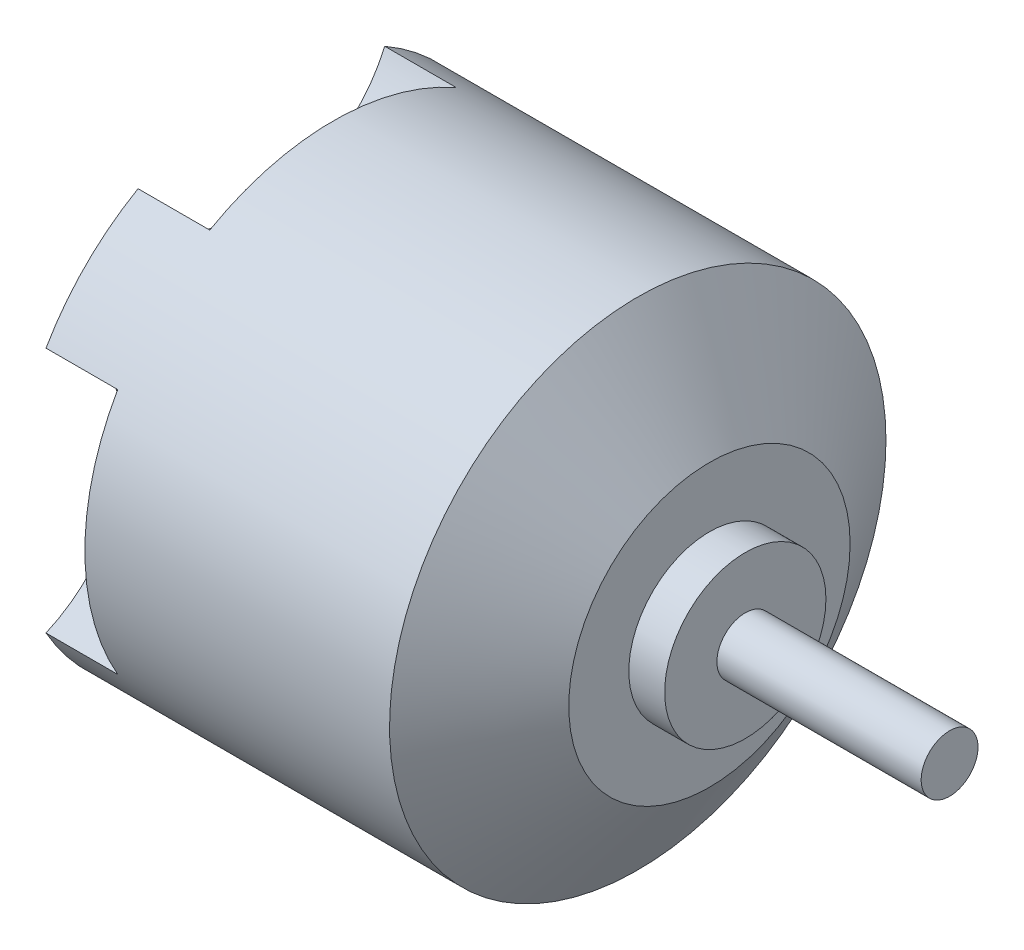
ISO-10303-21;
HEADER;
FILE_DESCRIPTION(('STEP AP214'),'2;1');
FILE_NAME('part.step','',(''),(''),'','','');
FILE_SCHEMA(('AUTOMOTIVE_DESIGN { 1 0 10303 214 1 1 1 1 }'));
ENDSEC;
DATA;
#1=APPLICATION_CONTEXT('core data for automotive mechanical design processes');
#2=APPLICATION_PROTOCOL_DEFINITION('international standard','automotive_design',2000,#1);
#3=PRODUCT_CONTEXT('',#1,'mechanical');
#4=PRODUCT('Part','Part','',(#3));
#5=PRODUCT_RELATED_PRODUCT_CATEGORY('part','',(#4));
#6=PRODUCT_DEFINITION_FORMATION('','',#4);
#7=PRODUCT_DEFINITION_CONTEXT('part definition',#1,'design');
#8=PRODUCT_DEFINITION('design','',#6,#7);
#9=PRODUCT_DEFINITION_SHAPE('','',#8);
#10=(LENGTH_UNIT() NAMED_UNIT(*) SI_UNIT(.MILLI.,.METRE.));
#11=(NAMED_UNIT(*) PLANE_ANGLE_UNIT() SI_UNIT($,.RADIAN.));
#12=(NAMED_UNIT(*) SI_UNIT($,.STERADIAN.) SOLID_ANGLE_UNIT());
#13=UNCERTAINTY_MEASURE_WITH_UNIT(LENGTH_MEASURE(1.E-05),#10,'distance_accuracy_value','');
#14=(GEOMETRIC_REPRESENTATION_CONTEXT(3) GLOBAL_UNCERTAINTY_ASSIGNED_CONTEXT((#13)) GLOBAL_UNIT_ASSIGNED_CONTEXT((#10,
#11,#12)) REPRESENTATION_CONTEXT('',''));
#15=CARTESIAN_POINT('',(0.,0.,0.));
#16=DIRECTION('',(0.,0.,1.));
#17=DIRECTION('',(1.,0.,0.));
#18=AXIS2_PLACEMENT_3D('',#15,#16,#17);
#19=CARTESIAN_POINT('',(25.,0.,0.));
#20=DIRECTION('',(-1.,0.,0.));
#21=DIRECTION('',(0.,0.,1.));
#22=AXIS2_PLACEMENT_3D('',#19,#20,#21);
#23=CYLINDRICAL_SURFACE('',#22,13.85);
#24=CARTESIAN_POINT('',(21.,0.,0.));
#25=DIRECTION('',(1.,0.,0.));
#26=DIRECTION('',(0.,0.,-1.));
#27=AXIS2_PLACEMENT_3D('',#24,#25,#26);
#28=CIRCLE('',#27,13.85);
#29=CARTESIAN_POINT('',(21.,0.,-13.85));
#30=VERTEX_POINT('',#29);
#31=EDGE_CURVE('E11',#30,#30,#28,.F.);
#32=ORIENTED_EDGE('',*,*,#31,.T.);
#33=EDGE_LOOP('',(#32));
#34=FACE_BOUND('',#33,.T.);
#35=CARTESIAN_POINT('',(0.,0.,0.));
#36=DIRECTION('',(1.,0.,0.));
#37=DIRECTION('',(0.,0.,-1.));
#38=AXIS2_PLACEMENT_3D('',#35,#36,#37);
#39=CIRCLE('',#38,13.85);
#40=CARTESIAN_POINT('',(0.,-6.88216069460667,12.0190833333333));
#41=VERTEX_POINT('',#40);
#42=CARTESIAN_POINT('',(0.,-12.0190833333334,6.88216069460662));
#43=VERTEX_POINT('',#42);
#44=EDGE_CURVE('E200',#41,#43,#39,.T.);
#45=ORIENTED_EDGE('',*,*,#44,.T.);
#46=DIRECTION('',(-1.,0.,0.));
#47=VECTOR('',#46,1.);
#48=CARTESIAN_POINT('',(4.,-12.0190833333334,6.88216069460662));
#49=LINE('',#48,#47);
#50=CARTESIAN_POINT('',(4.,-12.0190833333334,6.88216069460662));
#51=VERTEX_POINT('',#50);
#52=EDGE_CURVE('E152',#51,#43,#49,.T.);
#53=ORIENTED_EDGE('',*,*,#52,.F.);
#54=CARTESIAN_POINT('',(4.,0.,0.));
#55=DIRECTION('',(-1.,0.,0.));
#56=DIRECTION('',(0.,-1.,0.));
#57=AXIS2_PLACEMENT_3D('',#54,#55,#56);
#58=CIRCLE('',#57,13.85);
#59=CARTESIAN_POINT('',(4.,-12.0190833333333,-6.88216069460671));
#60=VERTEX_POINT('',#59);
#61=EDGE_CURVE('E146',#60,#51,#58,.T.);
#62=ORIENTED_EDGE('',*,*,#61,.F.);
#63=DIRECTION('',(-1.,0.,0.));
#64=VECTOR('',#63,1.);
#65=CARTESIAN_POINT('',(4.,-12.0190833333333,-6.88216069460671));
#66=LINE('',#65,#64);
#67=CARTESIAN_POINT('',(0.,-12.0190833333333,-6.88216069460671));
#68=VERTEX_POINT('',#67);
#69=EDGE_CURVE('E155',#60,#68,#66,.T.);
#70=ORIENTED_EDGE('',*,*,#69,.T.);
#71=CARTESIAN_POINT('',(0.,-6.88216069460666,-12.0190833333333));
#72=VERTEX_POINT('',#71);
#73=EDGE_CURVE('E203',#68,#72,#39,.T.);
#74=ORIENTED_EDGE('',*,*,#73,.T.);
#75=DIRECTION('',(-1.,0.,0.));
#76=VECTOR('',#75,1.);
#77=CARTESIAN_POINT('',(4.,-6.88216069460666,-12.0190833333333));
#78=LINE('',#77,#76);
#79=CARTESIAN_POINT('',(4.,-6.88216069460666,-12.0190833333333));
#80=VERTEX_POINT('',#79);
#81=EDGE_CURVE('E56',#80,#72,#78,.T.);
#82=ORIENTED_EDGE('',*,*,#81,.F.);
#83=CARTESIAN_POINT('',(4.,0.,0.));
#84=DIRECTION('',(-1.,0.,0.));
#85=DIRECTION('',(0.,0.,-1.));
#86=AXIS2_PLACEMENT_3D('',#83,#84,#85);
#87=CIRCLE('',#86,13.85);
#88=CARTESIAN_POINT('',(4.,6.88216069460667,-12.0190833333333));
#89=VERTEX_POINT('',#88);
#90=EDGE_CURVE('E160',#89,#80,#87,.T.);
#91=ORIENTED_EDGE('',*,*,#90,.F.);
#92=DIRECTION('',(-1.,0.,0.));
#93=VECTOR('',#92,1.);
#94=CARTESIAN_POINT('',(4.,6.88216069460667,-12.0190833333333));
#95=LINE('',#94,#93);
#96=CARTESIAN_POINT('',(0.,6.88216069460667,-12.0190833333333));
#97=VERTEX_POINT('',#96);
#98=EDGE_CURVE('E154',#89,#97,#95,.T.);
#99=ORIENTED_EDGE('',*,*,#98,.T.);
#100=CARTESIAN_POINT('',(0.,12.0190833333334,-6.88216069460654));
#101=VERTEX_POINT('',#100);
#102=EDGE_CURVE('E483',#97,#101,#39,.T.);
#103=ORIENTED_EDGE('',*,*,#102,.T.);
#104=DIRECTION('',(-1.,0.,0.));
#105=VECTOR('',#104,1.);
#106=CARTESIAN_POINT('',(4.,12.0190833333334,-6.88216069460654));
#107=LINE('',#106,#105);
#108=CARTESIAN_POINT('',(4.,12.0190833333334,-6.88216069460654));
#109=VERTEX_POINT('',#108);
#110=EDGE_CURVE('E48',#109,#101,#107,.T.);
#111=ORIENTED_EDGE('',*,*,#110,.F.);
#112=CARTESIAN_POINT('',(4.,0.,0.));
#113=DIRECTION('',(-1.,0.,0.));
#114=DIRECTION('',(0.,1.,0.));
#115=AXIS2_PLACEMENT_3D('',#112,#113,#114);
#116=CIRCLE('',#115,13.85);
#117=CARTESIAN_POINT('',(4.,12.0190833333333,6.88216069460679));
#118=VERTEX_POINT('',#117);
#119=EDGE_CURVE('E171',#118,#109,#116,.T.);
#120=ORIENTED_EDGE('',*,*,#119,.F.);
#121=DIRECTION('',(-1.,0.,0.));
#122=VECTOR('',#121,1.);
#123=CARTESIAN_POINT('',(4.,12.0190833333333,6.88216069460679));
#124=LINE('',#123,#122);
#125=CARTESIAN_POINT('',(0.,12.0190833333333,6.88216069460679));
#126=VERTEX_POINT('',#125);
#127=EDGE_CURVE('E167',#118,#126,#124,.T.);
#128=ORIENTED_EDGE('',*,*,#127,.T.);
#129=CARTESIAN_POINT('',(0.,6.88216069460666,12.0190833333333));
#130=VERTEX_POINT('',#129);
#131=EDGE_CURVE('E195',#126,#130,#39,.T.);
#132=ORIENTED_EDGE('',*,*,#131,.T.);
#133=DIRECTION('',(-1.,0.,0.));
#134=VECTOR('',#133,1.);
#135=CARTESIAN_POINT('',(4.,6.88216069460666,12.0190833333333));
#136=LINE('',#135,#134);
#137=CARTESIAN_POINT('',(4.,6.88216069460666,12.0190833333333));
#138=VERTEX_POINT('',#137);
#139=EDGE_CURVE('E185',#138,#130,#136,.T.);
#140=ORIENTED_EDGE('',*,*,#139,.F.);
#141=CARTESIAN_POINT('',(4.,0.,0.));
#142=DIRECTION('',(-1.,0.,0.));
#143=DIRECTION('',(0.,0.,1.));
#144=AXIS2_PLACEMENT_3D('',#141,#142,#143);
#145=CIRCLE('',#144,13.85);
#146=CARTESIAN_POINT('',(4.,-6.88216069460667,12.0190833333333));
#147=VERTEX_POINT('',#146);
#148=EDGE_CURVE('E180',#147,#138,#145,.T.);
#149=ORIENTED_EDGE('',*,*,#148,.F.);
#150=DIRECTION('',(-1.,0.,0.));
#151=VECTOR('',#150,1.);
#152=CARTESIAN_POINT('',(4.,-6.88216069460667,12.0190833333333));
#153=LINE('',#152,#151);
#154=EDGE_CURVE('E187',#147,#41,#153,.T.);
#155=ORIENTED_EDGE('',*,*,#154,.T.);
#156=EDGE_LOOP('',(#45,#53,#62,#70,#74,#82,#91,#99,#103,#111,#120,#128,#132,#140,#149,#155));
#157=FACE_BOUND('',#156,.T.);
#158=ADVANCED_FACE('F33',(#34,#157),#23,.T.);
#159=CARTESIAN_POINT('',(25.,0.,0.));
#160=DIRECTION('',(1.,0.,0.));
#161=DIRECTION('',(0.,0.,-1.));
#162=AXIS2_PLACEMENT_3D('',#159,#160,#161);
#163=PLANE('',#162);
#164=CARTESIAN_POINT('',(25.,0.,0.));
#165=DIRECTION('',(1.,0.,0.));
#166=DIRECTION('',(0.,0.,-1.));
#167=AXIS2_PLACEMENT_3D('',#164,#165,#166);
#168=CIRCLE('',#167,7.84999999999997);
#169=CARTESIAN_POINT('',(25.,0.,-7.84999999999997));
#170=VERTEX_POINT('',#169);
#171=EDGE_CURVE('E41',#170,#170,#168,.T.);
#172=ORIENTED_EDGE('',*,*,#171,.T.);
#173=EDGE_LOOP('',(#172));
#174=FACE_BOUND('',#173,.T.);
#175=CARTESIAN_POINT('',(25.,0.,0.));
#176=DIRECTION('',(1.,0.,0.));
#177=DIRECTION('',(0.,0.,-1.));
#178=AXIS2_PLACEMENT_3D('',#175,#176,#177);
#179=CIRCLE('',#178,4.5);
#180=CARTESIAN_POINT('',(25.,0.,-4.5));
#181=VERTEX_POINT('',#180);
#182=EDGE_CURVE('E196',#181,#181,#179,.T.);
#183=ORIENTED_EDGE('',*,*,#182,.F.);
#184=EDGE_LOOP('',(#183));
#185=FACE_BOUND('',#184,.T.);
#186=ADVANCED_FACE('F208',(#174,#185),#163,.T.);
#187=CARTESIAN_POINT('',(0.,0.,0.));
#188=DIRECTION('',(1.,0.,0.));
#189=DIRECTION('',(0.,0.,-1.));
#190=AXIS2_PLACEMENT_3D('',#187,#188,#189);
#191=PLANE('',#190);
#192=CARTESIAN_POINT('',(0.,0.,0.));
#193=DIRECTION('',(1.,0.,0.));
#194=DIRECTION('',(0.,0.,-1.));
#195=AXIS2_PLACEMENT_3D('',#192,#193,#194);
#196=CIRCLE('',#195,1.585);
#197=CARTESIAN_POINT('',(0.,0.,-1.585));
#198=VERTEX_POINT('',#197);
#199=EDGE_CURVE('E127',#198,#198,#196,.T.);
#200=ORIENTED_EDGE('',*,*,#199,.T.);
#201=EDGE_LOOP('',(#200));
#202=FACE_BOUND('',#201,.T.);
#203=CARTESIAN_POINT('',(0.,5.79868899732227,5.51137060197676));
#204=DIRECTION('',(-1.,0.,0.));
#205=DIRECTION('',(0.,0.,1.));
#206=AXIS2_PLACEMENT_3D('',#203,#204,#205);
#207=CIRCLE('',#206,1.5);
#208=CARTESIAN_POINT('',(0.,5.79868899732227,7.01137060197676));
#209=VERTEX_POINT('',#208);
#210=EDGE_CURVE('E121',#209,#209,#207,.T.);
#211=ORIENTED_EDGE('',*,*,#210,.F.);
#212=EDGE_LOOP('',(#211));
#213=FACE_BOUND('',#212,.T.);
#214=CARTESIAN_POINT('',(0.,-5.79868899732227,-5.51137060197676));
#215=DIRECTION('',(-1.,0.,0.));
#216=DIRECTION('',(0.,0.,1.));
#217=AXIS2_PLACEMENT_3D('',#214,#215,#216);
#218=CIRCLE('',#217,1.5);
#219=CARTESIAN_POINT('',(0.,-5.79868899732227,-4.01137060197676));
#220=VERTEX_POINT('',#219);
#221=EDGE_CURVE('E120',#220,#220,#218,.T.);
#222=ORIENTED_EDGE('',*,*,#221,.F.);
#223=EDGE_LOOP('',(#222));
#224=FACE_BOUND('',#223,.T.);
#225=CARTESIAN_POINT('',(0.,5.79868899732227,-5.51137060197676));
#226=DIRECTION('',(-1.,0.,0.));
#227=DIRECTION('',(0.,0.,1.));
#228=AXIS2_PLACEMENT_3D('',#225,#226,#227);
#229=CIRCLE('',#228,1.5);
#230=CARTESIAN_POINT('',(0.,5.79868899732227,-4.01137060197676));
#231=VERTEX_POINT('',#230);
#232=EDGE_CURVE('E133',#231,#231,#229,.T.);
#233=ORIENTED_EDGE('',*,*,#232,.F.);
#234=EDGE_LOOP('',(#233));
#235=FACE_BOUND('',#234,.T.);
#236=CARTESIAN_POINT('',(0.,-5.79868899732227,5.51137060197676));
#237=DIRECTION('',(-1.,0.,0.));
#238=DIRECTION('',(0.,0.,1.));
#239=AXIS2_PLACEMENT_3D('',#236,#237,#238);
#240=CIRCLE('',#239,1.5);
#241=CARTESIAN_POINT('',(0.,-5.79868899732227,7.01137060197676));
#242=VERTEX_POINT('',#241);
#243=EDGE_CURVE('E139',#242,#242,#240,.T.);
#244=ORIENTED_EDGE('',*,*,#243,.F.);
#245=EDGE_LOOP('',(#244));
#246=FACE_BOUND('',#245,.T.);
#247=ORIENTED_EDGE('',*,*,#73,.F.);
#248=CARTESIAN_POINT('',(0.,-15.,0.));
#249=DIRECTION('',(-1.,0.,0.));
#250=DIRECTION('',(0.,1.,0.));
#251=AXIS2_PLACEMENT_3D('',#248,#249,#250);
#252=CIRCLE('',#251,7.5);
#253=EDGE_CURVE('E149',#43,#68,#252,.T.);
#254=ORIENTED_EDGE('',*,*,#253,.F.);
#255=ORIENTED_EDGE('',*,*,#44,.F.);
#256=CARTESIAN_POINT('',(0.,0.,15.));
#257=DIRECTION('',(-1.,0.,0.));
#258=DIRECTION('',(0.,0.,-1.));
#259=AXIS2_PLACEMENT_3D('',#256,#257,#258);
#260=CIRCLE('',#259,7.5);
#261=EDGE_CURVE('E158',#130,#41,#260,.T.);
#262=ORIENTED_EDGE('',*,*,#261,.F.);
#263=ORIENTED_EDGE('',*,*,#131,.F.);
#264=CARTESIAN_POINT('',(0.,15.,1.57116660247941E-13));
#265=DIRECTION('',(-1.,0.,0.));
#266=DIRECTION('',(0.,-1.,0.));
#267=AXIS2_PLACEMENT_3D('',#264,#265,#266);
#268=CIRCLE('',#267,7.5);
#269=EDGE_CURVE('E145',#101,#126,#268,.T.);
#270=ORIENTED_EDGE('',*,*,#269,.F.);
#271=ORIENTED_EDGE('',*,*,#102,.F.);
#272=CARTESIAN_POINT('',(0.,0.,-15.));
#273=DIRECTION('',(-1.,0.,0.));
#274=DIRECTION('',(0.,0.,1.));
#275=AXIS2_PLACEMENT_3D('',#272,#273,#274);
#276=CIRCLE('',#275,7.5);
#277=EDGE_CURVE('E163',#72,#97,#276,.T.);
#278=ORIENTED_EDGE('',*,*,#277,.F.);
#279=EDGE_LOOP('',(#247,#254,#255,#262,#263,#270,#271,#278));
#280=FACE_BOUND('',#279,.T.);
#281=ADVANCED_FACE('F226',(#202,#213,#224,#235,#246,#280),#191,.F.);
#282=CARTESIAN_POINT('',(27.,0.,0.));
#283=DIRECTION('',(-1.,0.,0.));
#284=DIRECTION('',(0.,0.,1.));
#285=AXIS2_PLACEMENT_3D('',#282,#283,#284);
#286=CYLINDRICAL_SURFACE('',#285,4.5);
#287=CARTESIAN_POINT('',(27.,0.,0.));
#288=DIRECTION('',(1.,0.,0.));
#289=DIRECTION('',(0.,0.,-1.));
#290=AXIS2_PLACEMENT_3D('',#287,#288,#289);
#291=CIRCLE('',#290,4.5);
#292=CARTESIAN_POINT('',(27.,0.,-4.5));
#293=VERTEX_POINT('',#292);
#294=EDGE_CURVE('E190',#293,#293,#291,.T.);
#295=ORIENTED_EDGE('',*,*,#294,.F.);
#296=EDGE_LOOP('',(#295));
#297=FACE_BOUND('',#296,.T.);
#298=ORIENTED_EDGE('',*,*,#182,.T.);
#299=EDGE_LOOP('',(#298));
#300=FACE_BOUND('',#299,.T.);
#301=ADVANCED_FACE('F231',(#297,#300),#286,.T.);
#302=CARTESIAN_POINT('',(27.,0.,0.));
#303=DIRECTION('',(1.,0.,0.));
#304=DIRECTION('',(0.,0.,-1.));
#305=AXIS2_PLACEMENT_3D('',#302,#303,#304);
#306=PLANE('',#305);
#307=CARTESIAN_POINT('',(27.,0.,0.));
#308=DIRECTION('',(1.,0.,0.));
#309=DIRECTION('',(0.,0.,-1.));
#310=AXIS2_PLACEMENT_3D('',#307,#308,#309);
#311=CIRCLE('',#310,1.585);
#312=CARTESIAN_POINT('',(27.,0.,-1.585));
#313=VERTEX_POINT('',#312);
#314=EDGE_CURVE('E199',#313,#313,#311,.T.);
#315=ORIENTED_EDGE('',*,*,#314,.F.);
#316=EDGE_LOOP('',(#315));
#317=FACE_BOUND('',#316,.T.);
#318=ORIENTED_EDGE('',*,*,#294,.T.);
#319=EDGE_LOOP('',(#318));
#320=FACE_BOUND('',#319,.T.);
#321=ADVANCED_FACE('F236',(#317,#320),#306,.T.);
#322=CARTESIAN_POINT('',(4.,0.,15.));
#323=DIRECTION('',(-1.,0.,0.));
#324=DIRECTION('',(0.,0.,1.));
#325=AXIS2_PLACEMENT_3D('',#322,#323,#324);
#326=CYLINDRICAL_SURFACE('',#325,7.5);
#327=ORIENTED_EDGE('',*,*,#261,.T.);
#328=ORIENTED_EDGE('',*,*,#154,.F.);
#329=CARTESIAN_POINT('',(4.,0.,15.));
#330=DIRECTION('',(-1.,0.,0.));
#331=DIRECTION('',(0.,0.,-1.));
#332=AXIS2_PLACEMENT_3D('',#329,#330,#331);
#333=CIRCLE('',#332,7.5);
#334=EDGE_CURVE('E182',#138,#147,#333,.T.);
#335=ORIENTED_EDGE('',*,*,#334,.F.);
#336=ORIENTED_EDGE('',*,*,#139,.T.);
#337=EDGE_LOOP('',(#327,#328,#335,#336));
#338=FACE_BOUND('',#337,.T.);
#339=ADVANCED_FACE('F240',(#338),#326,.F.);
#340=CARTESIAN_POINT('',(4.,0.,7.5));
#341=DIRECTION('',(-1.,0.,0.));
#342=DIRECTION('',(0.,0.,1.));
#343=AXIS2_PLACEMENT_3D('',#340,#341,#342);
#344=PLANE('',#343);
#345=ORIENTED_EDGE('',*,*,#148,.T.);
#346=ORIENTED_EDGE('',*,*,#334,.T.);
#347=EDGE_LOOP('',(#345,#346));
#348=FACE_BOUND('',#347,.T.);
#349=ADVANCED_FACE('F244',(#348),#344,.T.);
#350=CARTESIAN_POINT('',(4.,15.,1.57116660247941E-13));
#351=DIRECTION('',(-1.,0.,0.));
#352=DIRECTION('',(0.,0.,1.));
#353=AXIS2_PLACEMENT_3D('',#350,#351,#352);
#354=CYLINDRICAL_SURFACE('',#353,7.5);
#355=ORIENTED_EDGE('',*,*,#269,.T.);
#356=ORIENTED_EDGE('',*,*,#127,.F.);
#357=CARTESIAN_POINT('',(4.,15.,1.57116660247941E-13));
#358=DIRECTION('',(-1.,0.,0.));
#359=DIRECTION('',(0.,-1.,0.));
#360=AXIS2_PLACEMENT_3D('',#357,#358,#359);
#361=CIRCLE('',#360,7.5);
#362=EDGE_CURVE('E173',#109,#118,#361,.T.);
#363=ORIENTED_EDGE('',*,*,#362,.F.);
#364=ORIENTED_EDGE('',*,*,#110,.T.);
#365=EDGE_LOOP('',(#355,#356,#363,#364));
#366=FACE_BOUND('',#365,.T.);
#367=ADVANCED_FACE('F248',(#366),#354,.F.);
#368=CARTESIAN_POINT('',(4.,7.5,0.));
#369=DIRECTION('',(-1.,0.,0.));
#370=DIRECTION('',(0.,1.,0.));
#371=AXIS2_PLACEMENT_3D('',#368,#369,#370);
#372=PLANE('',#371);
#373=ORIENTED_EDGE('',*,*,#119,.T.);
#374=ORIENTED_EDGE('',*,*,#362,.T.);
#375=EDGE_LOOP('',(#373,#374));
#376=FACE_BOUND('',#375,.T.);
#377=ADVANCED_FACE('F252',(#376),#372,.T.);
#378=CARTESIAN_POINT('',(4.,0.,-15.));
#379=DIRECTION('',(-1.,0.,0.));
#380=DIRECTION('',(0.,0.,1.));
#381=AXIS2_PLACEMENT_3D('',#378,#379,#380);
#382=CYLINDRICAL_SURFACE('',#381,7.5);
#383=ORIENTED_EDGE('',*,*,#277,.T.);
#384=ORIENTED_EDGE('',*,*,#98,.F.);
#385=CARTESIAN_POINT('',(4.,0.,-15.));
#386=DIRECTION('',(-1.,0.,0.));
#387=DIRECTION('',(0.,0.,1.));
#388=AXIS2_PLACEMENT_3D('',#385,#386,#387);
#389=CIRCLE('',#388,7.5);
#390=EDGE_CURVE('E162',#80,#89,#389,.T.);
#391=ORIENTED_EDGE('',*,*,#390,.F.);
#392=ORIENTED_EDGE('',*,*,#81,.T.);
#393=EDGE_LOOP('',(#383,#384,#391,#392));
#394=FACE_BOUND('',#393,.T.);
#395=ADVANCED_FACE('F255',(#394),#382,.F.);
#396=CARTESIAN_POINT('',(4.,0.,-7.5));
#397=DIRECTION('',(-1.,0.,0.));
#398=DIRECTION('',(0.,0.,-1.));
#399=AXIS2_PLACEMENT_3D('',#396,#397,#398);
#400=PLANE('',#399);
#401=ORIENTED_EDGE('',*,*,#90,.T.);
#402=ORIENTED_EDGE('',*,*,#390,.T.);
#403=EDGE_LOOP('',(#401,#402));
#404=FACE_BOUND('',#403,.T.);
#405=ADVANCED_FACE('F259',(#404),#400,.T.);
#406=CARTESIAN_POINT('',(4.,-15.,0.));
#407=DIRECTION('',(-1.,0.,0.));
#408=DIRECTION('',(0.,0.,1.));
#409=AXIS2_PLACEMENT_3D('',#406,#407,#408);
#410=CYLINDRICAL_SURFACE('',#409,7.5);
#411=ORIENTED_EDGE('',*,*,#253,.T.);
#412=ORIENTED_EDGE('',*,*,#69,.F.);
#413=CARTESIAN_POINT('',(4.,-15.,0.));
#414=DIRECTION('',(-1.,0.,0.));
#415=DIRECTION('',(0.,1.,0.));
#416=AXIS2_PLACEMENT_3D('',#413,#414,#415);
#417=CIRCLE('',#416,7.5);
#418=EDGE_CURVE('E148',#51,#60,#417,.T.);
#419=ORIENTED_EDGE('',*,*,#418,.F.);
#420=ORIENTED_EDGE('',*,*,#52,.T.);
#421=EDGE_LOOP('',(#411,#412,#419,#420));
#422=FACE_BOUND('',#421,.T.);
#423=ADVANCED_FACE('F262',(#422),#410,.F.);
#424=CARTESIAN_POINT('',(4.,-7.5,0.));
#425=DIRECTION('',(-1.,0.,0.));
#426=DIRECTION('',(0.,-1.,0.));
#427=AXIS2_PLACEMENT_3D('',#424,#425,#426);
#428=PLANE('',#427);
#429=ORIENTED_EDGE('',*,*,#61,.T.);
#430=ORIENTED_EDGE('',*,*,#418,.T.);
#431=EDGE_LOOP('',(#429,#430));
#432=FACE_BOUND('',#431,.T.);
#433=ADVANCED_FACE('F266',(#432),#428,.T.);
#434=CARTESIAN_POINT('',(4.,-5.79868899732227,5.51137060197676));
#435=DIRECTION('',(-1.,0.,0.));
#436=DIRECTION('',(0.,0.,1.));
#437=AXIS2_PLACEMENT_3D('',#434,#435,#436);
#438=CONICAL_SURFACE('',#437,1.5,1.02974425867665);
#439=CARTESIAN_POINT('',(4.90129092854134,-5.79868899732227,5.51137060197676));
#440=VERTEX_POINT('',#439);
#441=VERTEX_LOOP('',#440);
#442=FACE_BOUND('',#441,.T.);
#443=CARTESIAN_POINT('',(4.,-5.79868899732227,5.51137060197676));
#444=DIRECTION('',(-1.,0.,0.));
#445=DIRECTION('',(0.,0.,1.));
#446=AXIS2_PLACEMENT_3D('',#443,#444,#445);
#447=CIRCLE('',#446,1.5);
#448=CARTESIAN_POINT('',(4.,-5.79868899732227,7.01137060197676));
#449=VERTEX_POINT('',#448);
#450=EDGE_CURVE('E142',#449,#449,#447,.T.);
#451=ORIENTED_EDGE('',*,*,#450,.T.);
#452=EDGE_LOOP('',(#451));
#453=FACE_BOUND('',#452,.T.);
#454=ADVANCED_FACE('F270',(#442,#453),#438,.F.);
#455=CARTESIAN_POINT('',(0.,-5.79868899732227,5.51137060197676));
#456=DIRECTION('',(-1.,0.,0.));
#457=DIRECTION('',(0.,0.,1.));
#458=AXIS2_PLACEMENT_3D('',#455,#456,#457);
#459=CYLINDRICAL_SURFACE('',#458,1.5);
#460=ORIENTED_EDGE('',*,*,#450,.F.);
#461=EDGE_LOOP('',(#460));
#462=FACE_BOUND('',#461,.T.);
#463=ORIENTED_EDGE('',*,*,#243,.T.);
#464=EDGE_LOOP('',(#463));
#465=FACE_BOUND('',#464,.T.);
#466=ADVANCED_FACE('F274',(#462,#465),#459,.F.);
#467=CARTESIAN_POINT('',(4.,5.79868899732227,-5.51137060197676));
#468=DIRECTION('',(-1.,0.,0.));
#469=DIRECTION('',(0.,0.,1.));
#470=AXIS2_PLACEMENT_3D('',#467,#468,#469);
#471=CONICAL_SURFACE('',#470,1.5,1.02974425867665);
#472=CARTESIAN_POINT('',(4.90129092854134,5.79868899732226,-5.51137060197676));
#473=VERTEX_POINT('',#472);
#474=VERTEX_LOOP('',#473);
#475=FACE_BOUND('',#474,.T.);
#476=CARTESIAN_POINT('',(4.,5.79868899732227,-5.51137060197676));
#477=DIRECTION('',(-1.,0.,0.));
#478=DIRECTION('',(0.,0.,1.));
#479=AXIS2_PLACEMENT_3D('',#476,#477,#478);
#480=CIRCLE('',#479,1.5);
#481=CARTESIAN_POINT('',(4.,5.79868899732227,-4.01137060197676));
#482=VERTEX_POINT('',#481);
#483=EDGE_CURVE('E136',#482,#482,#480,.T.);
#484=ORIENTED_EDGE('',*,*,#483,.T.);
#485=EDGE_LOOP('',(#484));
#486=FACE_BOUND('',#485,.T.);
#487=ADVANCED_FACE('F278',(#475,#486),#471,.F.);
#488=CARTESIAN_POINT('',(0.,5.79868899732227,-5.51137060197676));
#489=DIRECTION('',(-1.,0.,0.));
#490=DIRECTION('',(0.,0.,1.));
#491=AXIS2_PLACEMENT_3D('',#488,#489,#490);
#492=CYLINDRICAL_SURFACE('',#491,1.5);
#493=ORIENTED_EDGE('',*,*,#483,.F.);
#494=EDGE_LOOP('',(#493));
#495=FACE_BOUND('',#494,.T.);
#496=ORIENTED_EDGE('',*,*,#232,.T.);
#497=EDGE_LOOP('',(#496));
#498=FACE_BOUND('',#497,.T.);
#499=ADVANCED_FACE('F282',(#495,#498),#492,.F.);
#500=CARTESIAN_POINT('',(4.,-5.79868899732227,-5.51137060197676));
#501=DIRECTION('',(-1.,0.,0.));
#502=DIRECTION('',(0.,0.,1.));
#503=AXIS2_PLACEMENT_3D('',#500,#501,#502);
#504=CONICAL_SURFACE('',#503,1.5,1.02974425867665);
#505=CARTESIAN_POINT('',(4.90129092854134,-5.79868899732227,-5.51137060197676));
#506=VERTEX_POINT('',#505);
#507=VERTEX_LOOP('',#506);
#508=FACE_BOUND('',#507,.T.);
#509=CARTESIAN_POINT('',(4.,-5.79868899732227,-5.51137060197676));
#510=DIRECTION('',(-1.,0.,0.));
#511=DIRECTION('',(0.,0.,1.));
#512=AXIS2_PLACEMENT_3D('',#509,#510,#511);
#513=CIRCLE('',#512,1.5);
#514=CARTESIAN_POINT('',(4.,-5.79868899732227,-4.01137060197676));
#515=VERTEX_POINT('',#514);
#516=EDGE_CURVE('E124',#515,#515,#513,.T.);
#517=ORIENTED_EDGE('',*,*,#516,.T.);
#518=EDGE_LOOP('',(#517));
#519=FACE_BOUND('',#518,.T.);
#520=ADVANCED_FACE('F286',(#508,#519),#504,.F.);
#521=CARTESIAN_POINT('',(0.,-5.79868899732227,-5.51137060197676));
#522=DIRECTION('',(-1.,0.,0.));
#523=DIRECTION('',(0.,0.,1.));
#524=AXIS2_PLACEMENT_3D('',#521,#522,#523);
#525=CYLINDRICAL_SURFACE('',#524,1.5);
#526=ORIENTED_EDGE('',*,*,#516,.F.);
#527=EDGE_LOOP('',(#526));
#528=FACE_BOUND('',#527,.T.);
#529=ORIENTED_EDGE('',*,*,#221,.T.);
#530=EDGE_LOOP('',(#529));
#531=FACE_BOUND('',#530,.T.);
#532=ADVANCED_FACE('F114',(#528,#531),#525,.F.);
#533=CARTESIAN_POINT('',(4.,5.79868899732227,5.51137060197676));
#534=DIRECTION('',(-1.,0.,0.));
#535=DIRECTION('',(0.,0.,1.));
#536=AXIS2_PLACEMENT_3D('',#533,#534,#535);
#537=CONICAL_SURFACE('',#536,1.5,1.02974425867665);
#538=CARTESIAN_POINT('',(4.90129092854134,5.79868899732226,5.51137060197676));
#539=VERTEX_POINT('',#538);
#540=VERTEX_LOOP('',#539);
#541=FACE_BOUND('',#540,.T.);
#542=CARTESIAN_POINT('',(4.,5.79868899732227,5.51137060197676));
#543=DIRECTION('',(-1.,0.,0.));
#544=DIRECTION('',(0.,0.,1.));
#545=AXIS2_PLACEMENT_3D('',#542,#543,#544);
#546=CIRCLE('',#545,1.5);
#547=CARTESIAN_POINT('',(4.,5.79868899732227,7.01137060197676));
#548=VERTEX_POINT('',#547);
#549=EDGE_CURVE('E118',#548,#548,#546,.T.);
#550=ORIENTED_EDGE('',*,*,#549,.T.);
#551=EDGE_LOOP('',(#550));
#552=FACE_BOUND('',#551,.T.);
#553=ADVANCED_FACE('F110',(#541,#552),#537,.F.);
#554=CARTESIAN_POINT('',(0.,5.79868899732227,5.51137060197676));
#555=DIRECTION('',(-1.,0.,0.));
#556=DIRECTION('',(0.,0.,1.));
#557=AXIS2_PLACEMENT_3D('',#554,#555,#556);
#558=CYLINDRICAL_SURFACE('',#557,1.5);
#559=ORIENTED_EDGE('',*,*,#549,.F.);
#560=EDGE_LOOP('',(#559));
#561=FACE_BOUND('',#560,.T.);
#562=ORIENTED_EDGE('',*,*,#210,.T.);
#563=EDGE_LOOP('',(#562));
#564=FACE_BOUND('',#563,.T.);
#565=ADVANCED_FACE('F113',(#561,#564),#558,.F.);
#566=CARTESIAN_POINT('',(38.4,0.,0.));
#567=DIRECTION('',(1.,0.,0.));
#568=DIRECTION('',(0.,0.,-1.));
#569=AXIS2_PLACEMENT_3D('',#566,#567,#568);
#570=PLANE('',#569);
#571=CARTESIAN_POINT('',(38.4,0.,0.));
#572=DIRECTION('',(1.,0.,0.));
#573=DIRECTION('',(0.,0.,-1.));
#574=AXIS2_PLACEMENT_3D('',#571,#572,#573);
#575=CIRCLE('',#574,1.585);
#576=CARTESIAN_POINT('',(38.4,0.,-1.585));
#577=VERTEX_POINT('',#576);
#578=EDGE_CURVE('E307',#577,#577,#575,.T.);
#579=ORIENTED_EDGE('',*,*,#578,.T.);
#580=EDGE_LOOP('',(#579));
#581=FACE_BOUND('',#580,.T.);
#582=ADVANCED_FACE('F296',(#581),#570,.T.);
#583=CARTESIAN_POINT('',(-1.6,0.,0.));
#584=DIRECTION('',(1.,0.,0.));
#585=DIRECTION('',(0.,0.,-1.));
#586=AXIS2_PLACEMENT_3D('',#583,#584,#585);
#587=CYLINDRICAL_SURFACE('',#586,1.585);
#588=ORIENTED_EDGE('',*,*,#314,.T.);
#589=EDGE_LOOP('',(#588));
#590=FACE_BOUND('',#589,.T.);
#591=ORIENTED_EDGE('',*,*,#578,.F.);
#592=EDGE_LOOP('',(#591));
#593=FACE_BOUND('',#592,.T.);
#594=ADVANCED_FACE('F297',(#590,#593),#587,.T.);
#595=CARTESIAN_POINT('',(-1.6,0.,0.));
#596=DIRECTION('',(1.,0.,0.));
#597=DIRECTION('',(0.,0.,-1.));
#598=AXIS2_PLACEMENT_3D('',#595,#596,#597);
#599=CIRCLE('',#598,1.585);
#600=CARTESIAN_POINT('',(-1.6,0.,-1.585));
#601=VERTEX_POINT('',#600);
#602=EDGE_CURVE('E309',#601,#601,#599,.T.);
#603=ORIENTED_EDGE('',*,*,#602,.T.);
#604=EDGE_LOOP('',(#603));
#605=FACE_BOUND('',#604,.T.);
#606=ORIENTED_EDGE('',*,*,#199,.F.);
#607=EDGE_LOOP('',(#606));
#608=FACE_BOUND('',#607,.T.);
#609=ADVANCED_FACE('F217',(#605,#608),#587,.T.);
#610=CARTESIAN_POINT('',(-1.6,0.,0.));
#611=DIRECTION('',(1.,0.,0.));
#612=DIRECTION('',(0.,0.,-1.));
#613=AXIS2_PLACEMENT_3D('',#610,#611,#612);
#614=PLANE('',#613);
#615=ORIENTED_EDGE('',*,*,#602,.F.);
#616=EDGE_LOOP('',(#615));
#617=FACE_BOUND('',#616,.T.);
#618=ADVANCED_FACE('F212',(#617),#614,.F.);
#619=CARTESIAN_POINT('',(25.,0.,0.));
#620=DIRECTION('',(-1.,0.,0.));
#621=DIRECTION('',(0.,0.,1.));
#622=AXIS2_PLACEMENT_3D('',#619,#620,#621);
#623=CONICAL_SURFACE('',#622,7.84999999999997,0.98279372324733);
#624=ORIENTED_EDGE('',*,*,#31,.F.);
#625=EDGE_LOOP('',(#624));
#626=FACE_BOUND('',#625,.T.);
#627=ORIENTED_EDGE('',*,*,#171,.F.);
#628=EDGE_LOOP('',(#627));
#629=FACE_BOUND('',#628,.T.);
#630=ADVANCED_FACE('F35',(#626,#629),#623,.T.);
#631=CLOSED_SHELL('',(#158,#186,#281,#301,#321,#339,#349,#367,#377,#395,#405,#423,#433,#454,
#466,#487,#499,#520,#532,#553,#565,#582,#594,#609,#618,#630));
#632=MANIFOLD_SOLID_BREP('B2',#631);
#633=ADVANCED_BREP_SHAPE_REPRESENTATION('',(#18,#632),#14);
#634=SHAPE_DEFINITION_REPRESENTATION(#9,#633);
ENDSEC;
END-ISO-10303-21;
